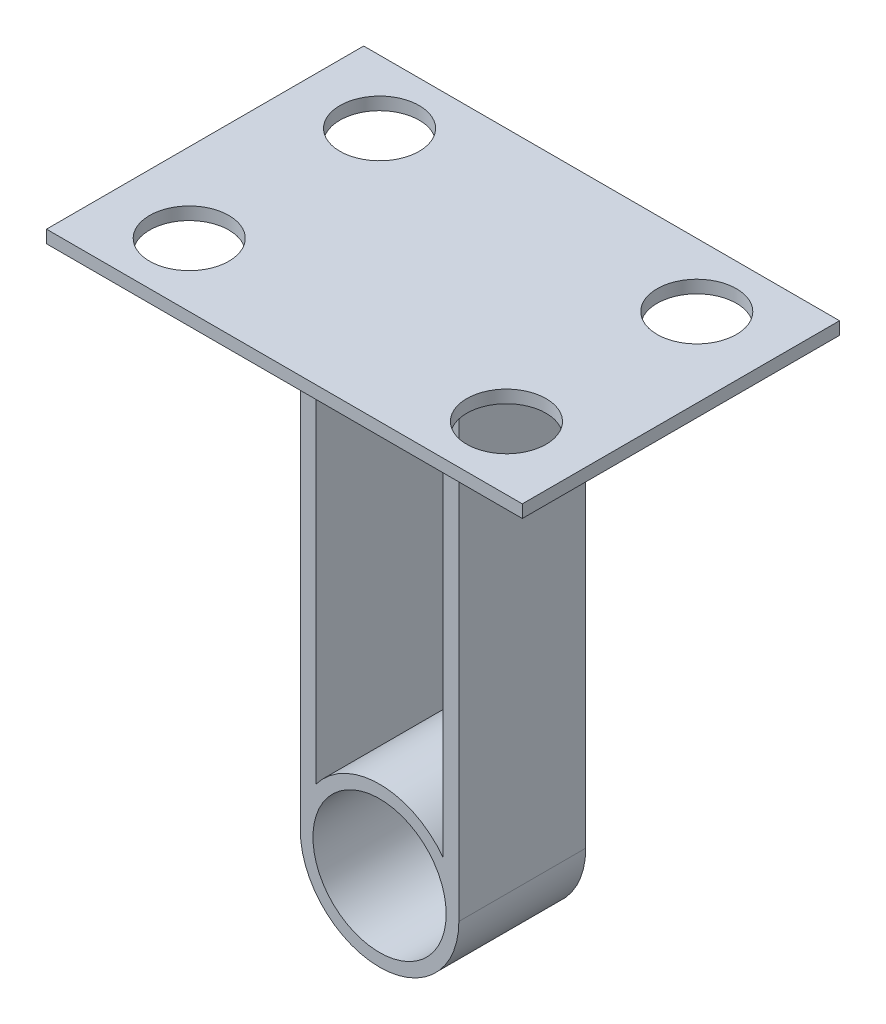
ISO-10303-21;
HEADER;
FILE_DESCRIPTION(('STEP AP214'),'2;1');
FILE_NAME('part.step','',(''),(''),'','','');
FILE_SCHEMA(('AUTOMOTIVE_DESIGN { 1 0 10303 214 1 1 1 1 }'));
ENDSEC;
DATA;
#1=APPLICATION_CONTEXT('core data for automotive mechanical design processes');
#2=APPLICATION_PROTOCOL_DEFINITION('international standard','automotive_design',2000,#1);
#3=PRODUCT_CONTEXT('',#1,'mechanical');
#4=PRODUCT('Part','Part','',(#3));
#5=PRODUCT_RELATED_PRODUCT_CATEGORY('part','',(#4));
#6=PRODUCT_DEFINITION_FORMATION('','',#4);
#7=PRODUCT_DEFINITION_CONTEXT('part definition',#1,'design');
#8=PRODUCT_DEFINITION('design','',#6,#7);
#9=PRODUCT_DEFINITION_SHAPE('','',#8);
#10=(LENGTH_UNIT() NAMED_UNIT(*) SI_UNIT(.MILLI.,.METRE.));
#11=(NAMED_UNIT(*) PLANE_ANGLE_UNIT() SI_UNIT($,.RADIAN.));
#12=(NAMED_UNIT(*) SI_UNIT($,.STERADIAN.) SOLID_ANGLE_UNIT());
#13=UNCERTAINTY_MEASURE_WITH_UNIT(LENGTH_MEASURE(1.E-05),#10,'distance_accuracy_value','');
#14=(GEOMETRIC_REPRESENTATION_CONTEXT(3) GLOBAL_UNCERTAINTY_ASSIGNED_CONTEXT((#13)) GLOBAL_UNIT_ASSIGNED_CONTEXT((#10,
#11,#12)) REPRESENTATION_CONTEXT('',''));
#15=CARTESIAN_POINT('',(0.,0.,0.));
#16=DIRECTION('',(0.,0.,1.));
#17=DIRECTION('',(1.,0.,0.));
#18=AXIS2_PLACEMENT_3D('',#15,#16,#17);
#19=CARTESIAN_POINT('',(0.,0.,5.08));
#20=DIRECTION('',(0.,0.,1.));
#21=DIRECTION('',(1.,0.,0.));
#22=AXIS2_PLACEMENT_3D('',#19,#20,#21);
#23=PLANE('',#22);
#24=CARTESIAN_POINT('',(0.,0.,5.08));
#25=DIRECTION('',(0.,0.,1.));
#26=DIRECTION('',(1.,0.,0.));
#27=AXIS2_PLACEMENT_3D('',#24,#25,#26);
#28=CIRCLE('',#27,3.175);
#29=CARTESIAN_POINT('',(-3.175,0.,5.08));
#30=VERTEX_POINT('',#29);
#31=CARTESIAN_POINT('',(3.175,0.,5.08));
#32=VERTEX_POINT('',#31);
#33=EDGE_CURVE('E206',#30,#32,#28,.T.);
#34=ORIENTED_EDGE('',*,*,#33,.T.);
#35=DIRECTION('',(0.,1.,0.));
#36=VECTOR('',#35,1.);
#37=CARTESIAN_POINT('',(3.175,0.,5.08));
#38=LINE('',#37,#36);
#39=CARTESIAN_POINT('',(3.175,19.05,5.08));
#40=VERTEX_POINT('',#39);
#41=EDGE_CURVE('E106',#32,#40,#38,.T.);
#42=ORIENTED_EDGE('',*,*,#41,.T.);
#43=DIRECTION('',(-1.,0.,0.));
#44=VECTOR('',#43,1.);
#45=CARTESIAN_POINT('',(3.175,19.05,5.08));
#46=LINE('',#45,#44);
#47=CARTESIAN_POINT('',(2.54,19.05,5.08));
#48=VERTEX_POINT('',#47);
#49=EDGE_CURVE('E211',#40,#48,#46,.T.);
#50=ORIENTED_EDGE('',*,*,#49,.T.);
#51=DIRECTION('',(0.,-1.,0.));
#52=VECTOR('',#51,1.);
#53=CARTESIAN_POINT('',(2.54,19.05,5.08));
#54=LINE('',#53,#52);
#55=CARTESIAN_POINT('',(2.54,1.905,5.08));
#56=VERTEX_POINT('',#55);
#57=EDGE_CURVE('E215',#48,#56,#54,.T.);
#58=ORIENTED_EDGE('',*,*,#57,.T.);
#59=CARTESIAN_POINT('',(0.,0.,5.08));
#60=DIRECTION('',(0.,0.,1.));
#61=DIRECTION('',(1.,0.,0.));
#62=AXIS2_PLACEMENT_3D('',#59,#60,#61);
#63=CIRCLE('',#62,3.175);
#64=CARTESIAN_POINT('',(-2.54,1.905,5.08));
#65=VERTEX_POINT('',#64);
#66=EDGE_CURVE('E218',#56,#65,#63,.T.);
#67=ORIENTED_EDGE('',*,*,#66,.T.);
#68=DIRECTION('',(0.,1.,0.));
#69=VECTOR('',#68,1.);
#70=CARTESIAN_POINT('',(-2.54,19.05,5.08));
#71=LINE('',#70,#69);
#72=CARTESIAN_POINT('',(-2.54,19.05,5.08));
#73=VERTEX_POINT('',#72);
#74=EDGE_CURVE('E221',#65,#73,#71,.T.);
#75=ORIENTED_EDGE('',*,*,#74,.T.);
#76=DIRECTION('',(-1.,0.,0.));
#77=VECTOR('',#76,1.);
#78=CARTESIAN_POINT('',(-3.175,19.05,5.08));
#79=LINE('',#78,#77);
#80=CARTESIAN_POINT('',(-3.175,19.05,5.08));
#81=VERTEX_POINT('',#80);
#82=EDGE_CURVE('E225',#73,#81,#79,.T.);
#83=ORIENTED_EDGE('',*,*,#82,.T.);
#84=DIRECTION('',(0.,-1.,0.));
#85=VECTOR('',#84,1.);
#86=CARTESIAN_POINT('',(-3.175,0.,5.08));
#87=LINE('',#86,#85);
#88=EDGE_CURVE('E59',#81,#30,#87,.T.);
#89=ORIENTED_EDGE('',*,*,#88,.T.);
#90=EDGE_LOOP('',(#34,#42,#50,#58,#67,#75,#83,#89));
#91=FACE_BOUND('',#90,.T.);
#92=CARTESIAN_POINT('',(0.,0.,5.08));
#93=DIRECTION('',(0.,0.,1.));
#94=DIRECTION('',(1.,0.,0.));
#95=AXIS2_PLACEMENT_3D('',#92,#93,#94);
#96=CIRCLE('',#95,2.667);
#97=CARTESIAN_POINT('',(2.667,0.,5.08));
#98=VERTEX_POINT('',#97);
#99=EDGE_CURVE('E195',#98,#98,#96,.T.);
#100=ORIENTED_EDGE('',*,*,#99,.F.);
#101=EDGE_LOOP('',(#100));
#102=FACE_BOUND('',#101,.T.);
#103=ADVANCED_FACE('F38',(#91,#102),#23,.T.);
#104=CARTESIAN_POINT('',(0.,0.,0.));
#105=DIRECTION('',(0.,0.,1.));
#106=DIRECTION('',(1.,0.,0.));
#107=AXIS2_PLACEMENT_3D('',#104,#105,#106);
#108=PLANE('',#107);
#109=CARTESIAN_POINT('',(0.,0.,0.));
#110=DIRECTION('',(0.,0.,1.));
#111=DIRECTION('',(1.,0.,0.));
#112=AXIS2_PLACEMENT_3D('',#109,#110,#111);
#113=CIRCLE('',#112,3.175);
#114=CARTESIAN_POINT('',(-3.175,0.,0.));
#115=VERTEX_POINT('',#114);
#116=CARTESIAN_POINT('',(3.175,0.,0.));
#117=VERTEX_POINT('',#116);
#118=EDGE_CURVE('E204',#115,#117,#113,.T.);
#119=ORIENTED_EDGE('',*,*,#118,.F.);
#120=DIRECTION('',(0.,-1.,0.));
#121=VECTOR('',#120,1.);
#122=CARTESIAN_POINT('',(-3.175,0.,0.));
#123=LINE('',#122,#121);
#124=CARTESIAN_POINT('',(-3.175,19.05,0.));
#125=VERTEX_POINT('',#124);
#126=EDGE_CURVE('E98',#125,#115,#123,.T.);
#127=ORIENTED_EDGE('',*,*,#126,.F.);
#128=DIRECTION('',(-1.,0.,0.));
#129=VECTOR('',#128,1.);
#130=CARTESIAN_POINT('',(-3.175,19.05,0.));
#131=LINE('',#130,#129);
#132=CARTESIAN_POINT('',(-2.54,19.05,0.));
#133=VERTEX_POINT('',#132);
#134=EDGE_CURVE('E91',#133,#125,#131,.T.);
#135=ORIENTED_EDGE('',*,*,#134,.F.);
#136=DIRECTION('',(0.,1.,0.));
#137=VECTOR('',#136,1.);
#138=CARTESIAN_POINT('',(-2.54,19.05,0.));
#139=LINE('',#138,#137);
#140=CARTESIAN_POINT('',(-2.54,1.905,0.));
#141=VERTEX_POINT('',#140);
#142=EDGE_CURVE('E247',#141,#133,#139,.T.);
#143=ORIENTED_EDGE('',*,*,#142,.F.);
#144=CARTESIAN_POINT('',(0.,0.,0.));
#145=DIRECTION('',(0.,0.,1.));
#146=DIRECTION('',(1.,0.,0.));
#147=AXIS2_PLACEMENT_3D('',#144,#145,#146);
#148=CIRCLE('',#147,3.175);
#149=CARTESIAN_POINT('',(2.54,1.905,0.));
#150=VERTEX_POINT('',#149);
#151=EDGE_CURVE('E244',#150,#141,#148,.T.);
#152=ORIENTED_EDGE('',*,*,#151,.F.);
#153=DIRECTION('',(0.,-1.,0.));
#154=VECTOR('',#153,1.);
#155=CARTESIAN_POINT('',(2.54,19.05,0.));
#156=LINE('',#155,#154);
#157=CARTESIAN_POINT('',(2.54,19.05,0.));
#158=VERTEX_POINT('',#157);
#159=EDGE_CURVE('E241',#158,#150,#156,.T.);
#160=ORIENTED_EDGE('',*,*,#159,.F.);
#161=DIRECTION('',(-1.,0.,0.));
#162=VECTOR('',#161,1.);
#163=CARTESIAN_POINT('',(3.175,19.05,0.));
#164=LINE('',#163,#162);
#165=CARTESIAN_POINT('',(3.175,19.05,0.));
#166=VERTEX_POINT('',#165);
#167=EDGE_CURVE('E238',#166,#158,#164,.T.);
#168=ORIENTED_EDGE('',*,*,#167,.F.);
#169=DIRECTION('',(0.,1.,0.));
#170=VECTOR('',#169,1.);
#171=CARTESIAN_POINT('',(3.175,0.,0.));
#172=LINE('',#171,#170);
#173=EDGE_CURVE('E234',#117,#166,#172,.T.);
#174=ORIENTED_EDGE('',*,*,#173,.F.);
#175=EDGE_LOOP('',(#119,#127,#135,#143,#152,#160,#168,#174));
#176=FACE_BOUND('',#175,.T.);
#177=CARTESIAN_POINT('',(0.,0.,0.));
#178=DIRECTION('',(0.,0.,1.));
#179=DIRECTION('',(1.,0.,0.));
#180=AXIS2_PLACEMENT_3D('',#177,#178,#179);
#181=CIRCLE('',#180,2.667);
#182=CARTESIAN_POINT('',(2.667,0.,0.));
#183=VERTEX_POINT('',#182);
#184=EDGE_CURVE('E190',#183,#183,#181,.T.);
#185=ORIENTED_EDGE('',*,*,#184,.T.);
#186=EDGE_LOOP('',(#185));
#187=FACE_BOUND('',#186,.T.);
#188=ADVANCED_FACE('F284',(#176,#187),#108,.F.);
#189=CARTESIAN_POINT('',(0.,0.,5.08));
#190=DIRECTION('',(0.,0.,-1.));
#191=DIRECTION('',(-1.,0.,0.));
#192=AXIS2_PLACEMENT_3D('',#189,#190,#191);
#193=CYLINDRICAL_SURFACE('',#192,3.175);
#194=ORIENTED_EDGE('',*,*,#118,.T.);
#195=DIRECTION('',(0.,0.,-1.));
#196=VECTOR('',#195,1.);
#197=CARTESIAN_POINT('',(3.175,0.,5.08));
#198=LINE('',#197,#196);
#199=EDGE_CURVE('E11',#32,#117,#198,.T.);
#200=ORIENTED_EDGE('',*,*,#199,.F.);
#201=ORIENTED_EDGE('',*,*,#33,.F.);
#202=DIRECTION('',(0.,0.,-1.));
#203=VECTOR('',#202,1.);
#204=CARTESIAN_POINT('',(-3.175,0.,5.08));
#205=LINE('',#204,#203);
#206=EDGE_CURVE('E230',#30,#115,#205,.T.);
#207=ORIENTED_EDGE('',*,*,#206,.T.);
#208=EDGE_LOOP('',(#194,#200,#201,#207));
#209=FACE_BOUND('',#208,.T.);
#210=ADVANCED_FACE('F40',(#209),#193,.T.);
#211=CARTESIAN_POINT('',(3.175,0.,5.08));
#212=DIRECTION('',(-1.,0.,0.));
#213=DIRECTION('',(0.,0.,1.));
#214=AXIS2_PLACEMENT_3D('',#211,#212,#213);
#215=PLANE('',#214);
#216=ORIENTED_EDGE('',*,*,#173,.T.);
#217=DIRECTION('',(0.,0.,-1.));
#218=VECTOR('',#217,1.);
#219=CARTESIAN_POINT('',(3.175,19.05,5.08));
#220=LINE('',#219,#218);
#221=EDGE_CURVE('E48',#40,#166,#220,.T.);
#222=ORIENTED_EDGE('',*,*,#221,.F.);
#223=ORIENTED_EDGE('',*,*,#41,.F.);
#224=ORIENTED_EDGE('',*,*,#199,.T.);
#225=EDGE_LOOP('',(#216,#222,#223,#224));
#226=FACE_BOUND('',#225,.T.);
#227=ADVANCED_FACE('F279',(#226),#215,.F.);
#228=CARTESIAN_POINT('',(2.54,19.05,5.08));
#229=DIRECTION('',(1.,0.,0.));
#230=DIRECTION('',(0.,1.,0.));
#231=AXIS2_PLACEMENT_3D('',#228,#229,#230);
#232=PLANE('',#231);
#233=ORIENTED_EDGE('',*,*,#159,.T.);
#234=DIRECTION('',(0.,0.,-1.));
#235=VECTOR('',#234,1.);
#236=CARTESIAN_POINT('',(2.54,1.905,5.08));
#237=LINE('',#236,#235);
#238=EDGE_CURVE('E267',#56,#150,#237,.T.);
#239=ORIENTED_EDGE('',*,*,#238,.F.);
#240=ORIENTED_EDGE('',*,*,#57,.F.);
#241=DIRECTION('',(0.,0.,-1.));
#242=VECTOR('',#241,1.);
#243=CARTESIAN_POINT('',(2.54,19.05,5.08));
#244=LINE('',#243,#242);
#245=EDGE_CURVE('E271',#48,#158,#244,.T.);
#246=ORIENTED_EDGE('',*,*,#245,.T.);
#247=EDGE_LOOP('',(#233,#239,#240,#246));
#248=FACE_BOUND('',#247,.T.);
#249=ADVANCED_FACE('F290',(#248),#232,.F.);
#250=CARTESIAN_POINT('',(0.,0.,5.08));
#251=DIRECTION('',(0.,0.,-1.));
#252=DIRECTION('',(-1.,0.,0.));
#253=AXIS2_PLACEMENT_3D('',#250,#251,#252);
#254=CYLINDRICAL_SURFACE('',#253,3.175);
#255=ORIENTED_EDGE('',*,*,#151,.T.);
#256=DIRECTION('',(0.,0.,-1.));
#257=VECTOR('',#256,1.);
#258=CARTESIAN_POINT('',(-2.54,1.905,5.08));
#259=LINE('',#258,#257);
#260=EDGE_CURVE('E263',#65,#141,#259,.T.);
#261=ORIENTED_EDGE('',*,*,#260,.F.);
#262=ORIENTED_EDGE('',*,*,#66,.F.);
#263=ORIENTED_EDGE('',*,*,#238,.T.);
#264=EDGE_LOOP('',(#255,#261,#262,#263));
#265=FACE_BOUND('',#264,.T.);
#266=ADVANCED_FACE('F294',(#265),#254,.T.);
#267=CARTESIAN_POINT('',(-2.54,19.05,5.08));
#268=DIRECTION('',(-1.,0.,0.));
#269=DIRECTION('',(0.,-1.,0.));
#270=AXIS2_PLACEMENT_3D('',#267,#268,#269);
#271=PLANE('',#270);
#272=ORIENTED_EDGE('',*,*,#142,.T.);
#273=DIRECTION('',(0.,0.,-1.));
#274=VECTOR('',#273,1.);
#275=CARTESIAN_POINT('',(-2.54,19.05,5.08));
#276=LINE('',#275,#274);
#277=EDGE_CURVE('E260',#73,#133,#276,.T.);
#278=ORIENTED_EDGE('',*,*,#277,.F.);
#279=ORIENTED_EDGE('',*,*,#74,.F.);
#280=ORIENTED_EDGE('',*,*,#260,.T.);
#281=EDGE_LOOP('',(#272,#278,#279,#280));
#282=FACE_BOUND('',#281,.T.);
#283=ADVANCED_FACE('F302',(#282),#271,.F.);
#284=CARTESIAN_POINT('',(-3.175,0.,5.08));
#285=DIRECTION('',(1.,0.,0.));
#286=DIRECTION('',(0.,0.,-1.));
#287=AXIS2_PLACEMENT_3D('',#284,#285,#286);
#288=PLANE('',#287);
#289=ORIENTED_EDGE('',*,*,#126,.T.);
#290=ORIENTED_EDGE('',*,*,#206,.F.);
#291=ORIENTED_EDGE('',*,*,#88,.F.);
#292=DIRECTION('',(0.,0.,-1.));
#293=VECTOR('',#292,1.);
#294=CARTESIAN_POINT('',(-3.175,19.05,5.08));
#295=LINE('',#294,#293);
#296=EDGE_CURVE('E257',#81,#125,#295,.T.);
#297=ORIENTED_EDGE('',*,*,#296,.T.);
#298=EDGE_LOOP('',(#289,#290,#291,#297));
#299=FACE_BOUND('',#298,.T.);
#300=ADVANCED_FACE('F303',(#299),#288,.F.);
#301=CARTESIAN_POINT('',(0.,0.,5.08));
#302=DIRECTION('',(0.,0.,-1.));
#303=DIRECTION('',(-1.,0.,0.));
#304=AXIS2_PLACEMENT_3D('',#301,#302,#303);
#305=CYLINDRICAL_SURFACE('',#304,2.667);
#306=ORIENTED_EDGE('',*,*,#99,.T.);
#307=EDGE_LOOP('',(#306));
#308=FACE_BOUND('',#307,.T.);
#309=ORIENTED_EDGE('',*,*,#184,.F.);
#310=EDGE_LOOP('',(#309));
#311=FACE_BOUND('',#310,.T.);
#312=ADVANCED_FACE('F305',(#308,#311),#305,.F.);
#313=CARTESIAN_POINT('',(0.,19.05,0.));
#314=DIRECTION('',(0.,1.,0.));
#315=DIRECTION('',(0.,0.,1.));
#316=AXIS2_PLACEMENT_3D('',#313,#314,#315);
#317=PLANE('',#316);
#318=CARTESIAN_POINT('',(-6.35,19.05,6.35));
#319=DIRECTION('',(0.,-1.,0.));
#320=DIRECTION('',(0.,0.,-1.));
#321=AXIS2_PLACEMENT_3D('',#318,#319,#320);
#322=CIRCLE('',#321,1.5875);
#323=CARTESIAN_POINT('',(-6.35,19.05,4.7625));
#324=VERTEX_POINT('',#323);
#325=EDGE_CURVE('E373',#324,#324,#322,.T.);
#326=ORIENTED_EDGE('',*,*,#325,.F.);
#327=EDGE_LOOP('',(#326));
#328=FACE_BOUND('',#327,.T.);
#329=CARTESIAN_POINT('',(6.35,19.05,-1.27));
#330=DIRECTION('',(0.,-1.,0.));
#331=DIRECTION('',(0.,0.,1.));
#332=AXIS2_PLACEMENT_3D('',#329,#330,#331);
#333=CIRCLE('',#332,1.5875);
#334=CARTESIAN_POINT('',(6.35,19.05,0.317500000000002));
#335=VERTEX_POINT('',#334);
#336=EDGE_CURVE('E365',#335,#335,#333,.T.);
#337=ORIENTED_EDGE('',*,*,#336,.F.);
#338=EDGE_LOOP('',(#337));
#339=FACE_BOUND('',#338,.T.);
#340=CARTESIAN_POINT('',(-6.35,19.05,-1.27));
#341=DIRECTION('',(0.,-1.,0.));
#342=DIRECTION('',(0.,0.,1.));
#343=AXIS2_PLACEMENT_3D('',#340,#341,#342);
#344=CIRCLE('',#343,1.5875);
#345=CARTESIAN_POINT('',(-6.35,19.05,0.317500000000001));
#346=VERTEX_POINT('',#345);
#347=EDGE_CURVE('E360',#346,#346,#344,.T.);
#348=ORIENTED_EDGE('',*,*,#347,.F.);
#349=EDGE_LOOP('',(#348));
#350=FACE_BOUND('',#349,.T.);
#351=CARTESIAN_POINT('',(6.35,19.05,6.35));
#352=DIRECTION('',(0.,-1.,0.));
#353=DIRECTION('',(0.,0.,-1.));
#354=AXIS2_PLACEMENT_3D('',#351,#352,#353);
#355=CIRCLE('',#354,1.5875);
#356=CARTESIAN_POINT('',(6.35,19.05,4.7625));
#357=VERTEX_POINT('',#356);
#358=EDGE_CURVE('E372',#357,#357,#355,.T.);
#359=ORIENTED_EDGE('',*,*,#358,.F.);
#360=EDGE_LOOP('',(#359));
#361=FACE_BOUND('',#360,.T.);
#362=DIRECTION('',(0.,0.,1.));
#363=VECTOR('',#362,1.);
#364=CARTESIAN_POINT('',(-9.525,19.05,-3.81));
#365=LINE('',#364,#363);
#366=CARTESIAN_POINT('',(-9.525,19.05,-3.81));
#367=VERTEX_POINT('',#366);
#368=CARTESIAN_POINT('',(-9.525,19.05,8.89));
#369=VERTEX_POINT('',#368);
#370=EDGE_CURVE('E188',#367,#369,#365,.T.);
#371=ORIENTED_EDGE('',*,*,#370,.F.);
#372=DIRECTION('',(-1.,0.,0.));
#373=VECTOR('',#372,1.);
#374=CARTESIAN_POINT('',(-9.525,19.05,-3.81));
#375=LINE('',#374,#373);
#376=CARTESIAN_POINT('',(9.525,19.05,-3.81));
#377=VERTEX_POINT('',#376);
#378=EDGE_CURVE('E184',#377,#367,#375,.T.);
#379=ORIENTED_EDGE('',*,*,#378,.F.);
#380=DIRECTION('',(0.,0.,-1.));
#381=VECTOR('',#380,1.);
#382=CARTESIAN_POINT('',(9.525,19.05,-3.81));
#383=LINE('',#382,#381);
#384=CARTESIAN_POINT('',(9.525,19.05,8.89));
#385=VERTEX_POINT('',#384);
#386=EDGE_CURVE('E399',#385,#377,#383,.T.);
#387=ORIENTED_EDGE('',*,*,#386,.F.);
#388=DIRECTION('',(1.,0.,0.));
#389=VECTOR('',#388,1.);
#390=CARTESIAN_POINT('',(-9.525,19.05,8.89));
#391=LINE('',#390,#389);
#392=EDGE_CURVE('E396',#369,#385,#391,.T.);
#393=ORIENTED_EDGE('',*,*,#392,.F.);
#394=EDGE_LOOP('',(#371,#379,#387,#393));
#395=FACE_BOUND('',#394,.T.);
#396=ORIENTED_EDGE('',*,*,#82,.F.);
#397=ORIENTED_EDGE('',*,*,#277,.T.);
#398=ORIENTED_EDGE('',*,*,#134,.T.);
#399=ORIENTED_EDGE('',*,*,#296,.F.);
#400=EDGE_LOOP('',(#396,#397,#398,#399));
#401=FACE_BOUND('',#400,.T.);
#402=ORIENTED_EDGE('',*,*,#49,.F.);
#403=ORIENTED_EDGE('',*,*,#221,.T.);
#404=ORIENTED_EDGE('',*,*,#167,.T.);
#405=ORIENTED_EDGE('',*,*,#245,.F.);
#406=EDGE_LOOP('',(#402,#403,#404,#405));
#407=FACE_BOUND('',#406,.T.);
#408=ADVANCED_FACE('F277',(#328,#339,#350,#361,#395,#401,#407),#317,.F.);
#409=CARTESIAN_POINT('',(-9.525,19.558,-3.81));
#410=DIRECTION('',(1.,0.,0.));
#411=DIRECTION('',(0.,0.,-1.));
#412=AXIS2_PLACEMENT_3D('',#409,#410,#411);
#413=PLANE('',#412);
#414=ORIENTED_EDGE('',*,*,#370,.T.);
#415=DIRECTION('',(0.,-1.,0.));
#416=VECTOR('',#415,1.);
#417=CARTESIAN_POINT('',(-9.525,19.558,8.89));
#418=LINE('',#417,#416);
#419=CARTESIAN_POINT('',(-9.525,19.558,8.89));
#420=VERTEX_POINT('',#419);
#421=EDGE_CURVE('E166',#420,#369,#418,.T.);
#422=ORIENTED_EDGE('',*,*,#421,.F.);
#423=DIRECTION('',(0.,0.,1.));
#424=VECTOR('',#423,1.);
#425=CARTESIAN_POINT('',(-9.525,19.558,-3.81));
#426=LINE('',#425,#424);
#427=CARTESIAN_POINT('',(-9.525,19.558,-3.81));
#428=VERTEX_POINT('',#427);
#429=EDGE_CURVE('E174',#428,#420,#426,.T.);
#430=ORIENTED_EDGE('',*,*,#429,.F.);
#431=DIRECTION('',(0.,-1.,0.));
#432=VECTOR('',#431,1.);
#433=CARTESIAN_POINT('',(-9.525,19.558,-3.81));
#434=LINE('',#433,#432);
#435=EDGE_CURVE('E394',#428,#367,#434,.T.);
#436=ORIENTED_EDGE('',*,*,#435,.T.);
#437=EDGE_LOOP('',(#414,#422,#430,#436));
#438=FACE_BOUND('',#437,.T.);
#439=ADVANCED_FACE('F186',(#438),#413,.F.);
#440=CARTESIAN_POINT('',(-9.525,19.558,8.89));
#441=DIRECTION('',(0.,0.,-1.));
#442=DIRECTION('',(-1.,0.,0.));
#443=AXIS2_PLACEMENT_3D('',#440,#441,#442);
#444=PLANE('',#443);
#445=ORIENTED_EDGE('',*,*,#392,.T.);
#446=DIRECTION('',(0.,-1.,0.));
#447=VECTOR('',#446,1.);
#448=CARTESIAN_POINT('',(9.525,19.558,8.89));
#449=LINE('',#448,#447);
#450=CARTESIAN_POINT('',(9.525,19.558,8.89));
#451=VERTEX_POINT('',#450);
#452=EDGE_CURVE('E169',#451,#385,#449,.T.);
#453=ORIENTED_EDGE('',*,*,#452,.F.);
#454=DIRECTION('',(1.,0.,0.));
#455=VECTOR('',#454,1.);
#456=CARTESIAN_POINT('',(-9.525,19.558,8.89));
#457=LINE('',#456,#455);
#458=EDGE_CURVE('E162',#420,#451,#457,.T.);
#459=ORIENTED_EDGE('',*,*,#458,.F.);
#460=ORIENTED_EDGE('',*,*,#421,.T.);
#461=EDGE_LOOP('',(#445,#453,#459,#460));
#462=FACE_BOUND('',#461,.T.);
#463=ADVANCED_FACE('F164',(#462),#444,.F.);
#464=CARTESIAN_POINT('',(9.525,19.558,-3.81));
#465=DIRECTION('',(-1.,0.,0.));
#466=DIRECTION('',(0.,0.,1.));
#467=AXIS2_PLACEMENT_3D('',#464,#465,#466);
#468=PLANE('',#467);
#469=ORIENTED_EDGE('',*,*,#386,.T.);
#470=DIRECTION('',(0.,-1.,0.));
#471=VECTOR('',#470,1.);
#472=CARTESIAN_POINT('',(9.525,19.558,-3.81));
#473=LINE('',#472,#471);
#474=CARTESIAN_POINT('',(9.525,19.558,-3.81));
#475=VERTEX_POINT('',#474);
#476=EDGE_CURVE('E198',#475,#377,#473,.T.);
#477=ORIENTED_EDGE('',*,*,#476,.F.);
#478=DIRECTION('',(0.,0.,-1.));
#479=VECTOR('',#478,1.);
#480=CARTESIAN_POINT('',(9.525,19.558,-3.81));
#481=LINE('',#480,#479);
#482=EDGE_CURVE('E173',#451,#475,#481,.T.);
#483=ORIENTED_EDGE('',*,*,#482,.F.);
#484=ORIENTED_EDGE('',*,*,#452,.T.);
#485=EDGE_LOOP('',(#469,#477,#483,#484));
#486=FACE_BOUND('',#485,.T.);
#487=ADVANCED_FACE('F325',(#486),#468,.F.);
#488=CARTESIAN_POINT('',(-9.525,19.558,-3.81));
#489=DIRECTION('',(0.,0.,1.));
#490=DIRECTION('',(1.,0.,0.));
#491=AXIS2_PLACEMENT_3D('',#488,#489,#490);
#492=PLANE('',#491);
#493=ORIENTED_EDGE('',*,*,#378,.T.);
#494=ORIENTED_EDGE('',*,*,#435,.F.);
#495=DIRECTION('',(-1.,0.,0.));
#496=VECTOR('',#495,1.);
#497=CARTESIAN_POINT('',(-9.525,19.558,-3.81));
#498=LINE('',#497,#496);
#499=EDGE_CURVE('E179',#475,#428,#498,.T.);
#500=ORIENTED_EDGE('',*,*,#499,.F.);
#501=ORIENTED_EDGE('',*,*,#476,.T.);
#502=EDGE_LOOP('',(#493,#494,#500,#501));
#503=FACE_BOUND('',#502,.T.);
#504=ADVANCED_FACE('F328',(#503),#492,.F.);
#505=CARTESIAN_POINT('',(0.,19.558,0.));
#506=DIRECTION('',(0.,1.,0.));
#507=DIRECTION('',(0.,0.,1.));
#508=AXIS2_PLACEMENT_3D('',#505,#506,#507);
#509=PLANE('',#508);
#510=CARTESIAN_POINT('',(-6.35,19.558,6.35));
#511=DIRECTION('',(0.,-1.,0.));
#512=DIRECTION('',(0.,0.,-1.));
#513=AXIS2_PLACEMENT_3D('',#510,#511,#512);
#514=CIRCLE('',#513,1.5875);
#515=CARTESIAN_POINT('',(-6.35,19.558,4.7625));
#516=VERTEX_POINT('',#515);
#517=EDGE_CURVE('E368',#516,#516,#514,.T.);
#518=ORIENTED_EDGE('',*,*,#517,.T.);
#519=EDGE_LOOP('',(#518));
#520=FACE_BOUND('',#519,.T.);
#521=CARTESIAN_POINT('',(6.35,19.558,-1.27));
#522=DIRECTION('',(0.,-1.,0.));
#523=DIRECTION('',(0.,0.,1.));
#524=AXIS2_PLACEMENT_3D('',#521,#522,#523);
#525=CIRCLE('',#524,1.5875);
#526=CARTESIAN_POINT('',(6.35,19.558,0.317500000000002));
#527=VERTEX_POINT('',#526);
#528=EDGE_CURVE('E377',#527,#527,#525,.T.);
#529=ORIENTED_EDGE('',*,*,#528,.T.);
#530=EDGE_LOOP('',(#529));
#531=FACE_BOUND('',#530,.T.);
#532=CARTESIAN_POINT('',(-6.35,19.558,-1.27));
#533=DIRECTION('',(0.,-1.,0.));
#534=DIRECTION('',(0.,0.,1.));
#535=AXIS2_PLACEMENT_3D('',#532,#533,#534);
#536=CIRCLE('',#535,1.5875);
#537=CARTESIAN_POINT('',(-6.35,19.558,0.317500000000001));
#538=VERTEX_POINT('',#537);
#539=EDGE_CURVE('E357',#538,#538,#536,.T.);
#540=ORIENTED_EDGE('',*,*,#539,.T.);
#541=EDGE_LOOP('',(#540));
#542=FACE_BOUND('',#541,.T.);
#543=CARTESIAN_POINT('',(6.35,19.558,6.35));
#544=DIRECTION('',(0.,-1.,0.));
#545=DIRECTION('',(0.,0.,-1.));
#546=AXIS2_PLACEMENT_3D('',#543,#544,#545);
#547=CIRCLE('',#546,1.5875);
#548=CARTESIAN_POINT('',(6.35,19.558,4.7625));
#549=VERTEX_POINT('',#548);
#550=EDGE_CURVE('E384',#549,#549,#547,.T.);
#551=ORIENTED_EDGE('',*,*,#550,.T.);
#552=EDGE_LOOP('',(#551));
#553=FACE_BOUND('',#552,.T.);
#554=ORIENTED_EDGE('',*,*,#429,.T.);
#555=ORIENTED_EDGE('',*,*,#458,.T.);
#556=ORIENTED_EDGE('',*,*,#482,.T.);
#557=ORIENTED_EDGE('',*,*,#499,.T.);
#558=EDGE_LOOP('',(#554,#555,#556,#557));
#559=FACE_BOUND('',#558,.T.);
#560=ADVANCED_FACE('F177',(#520,#531,#542,#553,#559),#509,.T.);
#561=CARTESIAN_POINT('',(6.35,19.558,6.35));
#562=DIRECTION('',(0.,-1.,0.));
#563=DIRECTION('',(0.,0.,-1.));
#564=AXIS2_PLACEMENT_3D('',#561,#562,#563);
#565=CYLINDRICAL_SURFACE('',#564,1.5875);
#566=ORIENTED_EDGE('',*,*,#550,.F.);
#567=EDGE_LOOP('',(#566));
#568=FACE_BOUND('',#567,.T.);
#569=ORIENTED_EDGE('',*,*,#358,.T.);
#570=EDGE_LOOP('',(#569));
#571=FACE_BOUND('',#570,.T.);
#572=ADVANCED_FACE('F338',(#568,#571),#565,.F.);
#573=CARTESIAN_POINT('',(-6.35,19.558,-1.27));
#574=DIRECTION('',(0.,-1.,0.));
#575=DIRECTION('',(0.,0.,-1.));
#576=AXIS2_PLACEMENT_3D('',#573,#574,#575);
#577=CYLINDRICAL_SURFACE('',#576,1.5875);
#578=ORIENTED_EDGE('',*,*,#539,.F.);
#579=EDGE_LOOP('',(#578));
#580=FACE_BOUND('',#579,.T.);
#581=ORIENTED_EDGE('',*,*,#347,.T.);
#582=EDGE_LOOP('',(#581));
#583=FACE_BOUND('',#582,.T.);
#584=ADVANCED_FACE('F342',(#580,#583),#577,.F.);
#585=CARTESIAN_POINT('',(6.35,19.558,-1.27));
#586=DIRECTION('',(0.,-1.,0.));
#587=DIRECTION('',(0.,0.,-1.));
#588=AXIS2_PLACEMENT_3D('',#585,#586,#587);
#589=CYLINDRICAL_SURFACE('',#588,1.5875);
#590=ORIENTED_EDGE('',*,*,#528,.F.);
#591=EDGE_LOOP('',(#590));
#592=FACE_BOUND('',#591,.T.);
#593=ORIENTED_EDGE('',*,*,#336,.T.);
#594=EDGE_LOOP('',(#593));
#595=FACE_BOUND('',#594,.T.);
#596=ADVANCED_FACE('F344',(#592,#595),#589,.F.);
#597=CARTESIAN_POINT('',(-6.35,19.558,6.35));
#598=DIRECTION('',(0.,-1.,0.));
#599=DIRECTION('',(0.,0.,-1.));
#600=AXIS2_PLACEMENT_3D('',#597,#598,#599);
#601=CYLINDRICAL_SURFACE('',#600,1.5875);
#602=ORIENTED_EDGE('',*,*,#517,.F.);
#603=EDGE_LOOP('',(#602));
#604=FACE_BOUND('',#603,.T.);
#605=ORIENTED_EDGE('',*,*,#325,.T.);
#606=EDGE_LOOP('',(#605));
#607=FACE_BOUND('',#606,.T.);
#608=ADVANCED_FACE('F347',(#604,#607),#601,.F.);
#609=CLOSED_SHELL('',(#103,#188,#210,#227,#249,#266,#283,#300,#312,#408,#439,#463,#487,#504,
#560,#572,#584,#596,#608));
#610=MANIFOLD_SOLID_BREP('B2',#609);
#611=ADVANCED_BREP_SHAPE_REPRESENTATION('',(#18,#610),#14);
#612=SHAPE_DEFINITION_REPRESENTATION(#9,#611);
ENDSEC;
END-ISO-10303-21;
